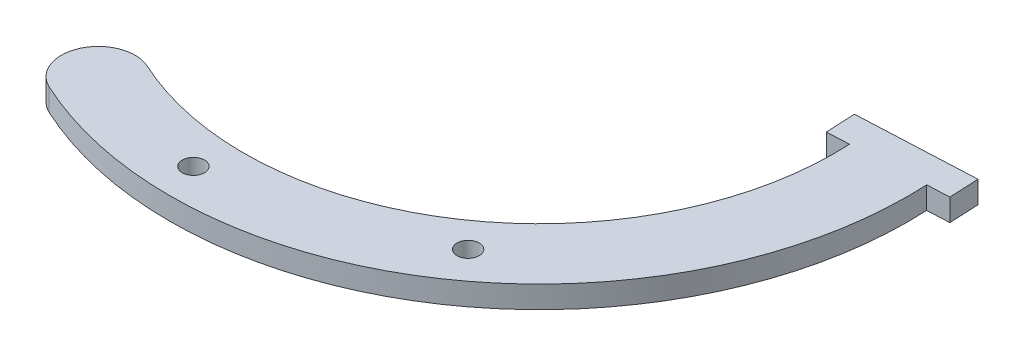
ISO-10303-21;
HEADER;
FILE_DESCRIPTION(('STEP AP214'),'2;1');
FILE_NAME('part.step','',(''),(''),'','','');
FILE_SCHEMA(('AUTOMOTIVE_DESIGN { 1 0 10303 214 1 1 1 1 }'));
ENDSEC;
DATA;
#1=APPLICATION_CONTEXT('core data for automotive mechanical design processes');
#2=APPLICATION_PROTOCOL_DEFINITION('international standard','automotive_design',2000,#1);
#3=PRODUCT_CONTEXT('',#1,'mechanical');
#4=PRODUCT('Part','Part','',(#3));
#5=PRODUCT_RELATED_PRODUCT_CATEGORY('part','',(#4));
#6=PRODUCT_DEFINITION_FORMATION('','',#4);
#7=PRODUCT_DEFINITION_CONTEXT('part definition',#1,'design');
#8=PRODUCT_DEFINITION('design','',#6,#7);
#9=PRODUCT_DEFINITION_SHAPE('','',#8);
#10=(LENGTH_UNIT() NAMED_UNIT(*) SI_UNIT(.MILLI.,.METRE.));
#11=(NAMED_UNIT(*) PLANE_ANGLE_UNIT() SI_UNIT($,.RADIAN.));
#12=(NAMED_UNIT(*) SI_UNIT($,.STERADIAN.) SOLID_ANGLE_UNIT());
#13=UNCERTAINTY_MEASURE_WITH_UNIT(LENGTH_MEASURE(1.E-05),#10,'distance_accuracy_value','');
#14=(GEOMETRIC_REPRESENTATION_CONTEXT(3) GLOBAL_UNCERTAINTY_ASSIGNED_CONTEXT((#13)) GLOBAL_UNIT_ASSIGNED_CONTEXT((#10,
#11,#12)) REPRESENTATION_CONTEXT('',''));
#15=CARTESIAN_POINT('',(0.,0.,0.));
#16=DIRECTION('',(0.,0.,1.));
#17=DIRECTION('',(1.,0.,0.));
#18=AXIS2_PLACEMENT_3D('',#15,#16,#17);
#19=CARTESIAN_POINT('',(2.25579232948525,3.,9.30013161079132));
#20=DIRECTION('',(0.,-1.,0.));
#21=DIRECTION('',(0.,0.,-1.));
#22=AXIS2_PLACEMENT_3D('',#19,#20,#21);
#23=CYLINDRICAL_SURFACE('',#22,5.);
#24=CARTESIAN_POINT('',(2.25579232948525,0.,9.30013161079132));
#25=DIRECTION('',(0.,1.,0.));
#26=DIRECTION('',(0.,0.,1.));
#27=AXIS2_PLACEMENT_3D('',#24,#25,#26);
#28=CIRCLE('',#27,5.);
#29=CARTESIAN_POINT('',(4.34663921270161,0.,4.7582862467411));
#30=VERTEX_POINT('',#29);
#31=CARTESIAN_POINT('',(0.164945446268869,0.,13.8419769748415));
#32=VERTEX_POINT('',#31);
#33=EDGE_CURVE('E150',#30,#32,#28,.T.);
#34=ORIENTED_EDGE('',*,*,#33,.T.);
#35=DIRECTION('',(0.,-1.,0.));
#36=VECTOR('',#35,1.);
#37=CARTESIAN_POINT('',(0.164945446268869,3.,13.8419769748415));
#38=LINE('',#37,#36);
#39=CARTESIAN_POINT('',(0.164945446268869,3.,13.8419769748415));
#40=VERTEX_POINT('',#39);
#41=EDGE_CURVE('E11',#40,#32,#38,.T.);
#42=ORIENTED_EDGE('',*,*,#41,.F.);
#43=CARTESIAN_POINT('',(2.25579232948525,3.,9.30013161079132));
#44=DIRECTION('',(0.,1.,0.));
#45=DIRECTION('',(0.,0.,1.));
#46=AXIS2_PLACEMENT_3D('',#43,#44,#45);
#47=CIRCLE('',#46,5.);
#48=CARTESIAN_POINT('',(4.34663921270161,3.,4.7582862467411));
#49=VERTEX_POINT('',#48);
#50=EDGE_CURVE('E207',#49,#40,#47,.T.);
#51=ORIENTED_EDGE('',*,*,#50,.F.);
#52=DIRECTION('',(0.,-1.,0.));
#53=VECTOR('',#52,1.);
#54=CARTESIAN_POINT('',(4.34663921270161,3.,4.7582862467411));
#55=LINE('',#54,#53);
#56=EDGE_CURVE('E57',#49,#30,#55,.T.);
#57=ORIENTED_EDGE('',*,*,#56,.T.);
#58=EDGE_LOOP('',(#34,#42,#51,#57));
#59=FACE_BOUND('',#58,.T.);
#60=ADVANCED_FACE('F40',(#59),#23,.T.);
#61=CARTESIAN_POINT('',(21.0734142784327,3.,-31.5764766656605));
#62=DIRECTION('',(0.,-1.,0.));
#63=DIRECTION('',(0.,0.,-1.));
#64=AXIS2_PLACEMENT_3D('',#61,#62,#63);
#65=CYLINDRICAL_SURFACE('',#64,50.);
#66=CARTESIAN_POINT('',(21.0734142784327,0.,-31.5764766656605));
#67=DIRECTION('',(0.,1.,0.));
#68=DIRECTION('',(0.,0.,1.));
#69=AXIS2_PLACEMENT_3D('',#66,#67,#68);
#70=CIRCLE('',#69,50.);
#71=CARTESIAN_POINT('',(71.0113295060892,0.,-34.067384675884));
#72=VERTEX_POINT('',#71);
#73=EDGE_CURVE('E152',#32,#72,#70,.T.);
#74=ORIENTED_EDGE('',*,*,#73,.T.);
#75=DIRECTION('',(0.,-1.,0.));
#76=VECTOR('',#75,1.);
#77=CARTESIAN_POINT('',(71.0113295060892,3.,-34.067384675884));
#78=LINE('',#77,#76);
#79=CARTESIAN_POINT('',(71.0113295060892,3.,-34.067384675884));
#80=VERTEX_POINT('',#79);
#81=EDGE_CURVE('E49',#80,#72,#78,.T.);
#82=ORIENTED_EDGE('',*,*,#81,.F.);
#83=CARTESIAN_POINT('',(21.0734142784327,3.,-31.5764766656605));
#84=DIRECTION('',(0.,1.,0.));
#85=DIRECTION('',(0.,0.,1.));
#86=AXIS2_PLACEMENT_3D('',#83,#84,#85);
#87=CIRCLE('',#86,50.);
#88=EDGE_CURVE('E98',#40,#80,#87,.T.);
#89=ORIENTED_EDGE('',*,*,#88,.F.);
#90=ORIENTED_EDGE('',*,*,#41,.T.);
#91=EDGE_LOOP('',(#74,#82,#89,#90));
#92=FACE_BOUND('',#91,.T.);
#93=ADVANCED_FACE('F235',(#92),#65,.T.);
#94=CARTESIAN_POINT('',(-1.42214087214097,3.,-30.7134611929984));
#95=DIRECTION('',(-0.0462539459495226,0.,-0.998929713485438));
#96=DIRECTION('',(-0.998929713485438,0.,0.0462539459495226));
#97=AXIS2_PLACEMENT_3D('',#94,#95,#96);
#98=PLANE('',#97);
#99=DIRECTION('',(0.998929713485438,0.,-0.0462539459495226));
#100=VECTOR('',#99,1.);
#101=CARTESIAN_POINT('',(-1.42214087214097,0.,-30.7134611929984));
#102=LINE('',#101,#100);
#103=CARTESIAN_POINT('',(74.0080788981386,0.,-34.2061446732421));
#104=VERTEX_POINT('',#103);
#105=EDGE_CURVE('E154',#72,#104,#102,.T.);
#106=ORIENTED_EDGE('',*,*,#105,.T.);
#107=DIRECTION('',(0.,-1.,0.));
#108=VECTOR('',#107,1.);
#109=CARTESIAN_POINT('',(74.0080788981386,3.,-34.2061446732421));
#110=LINE('',#109,#108);
#111=CARTESIAN_POINT('',(74.0080788981386,3.,-34.2061446732421));
#112=VERTEX_POINT('',#111);
#113=EDGE_CURVE('E178',#112,#104,#110,.T.);
#114=ORIENTED_EDGE('',*,*,#113,.F.);
#115=DIRECTION('',(0.998929713485438,0.,-0.0462539459495226));
#116=VECTOR('',#115,1.);
#117=CARTESIAN_POINT('',(-1.42214087214097,3.,-30.7134611929984));
#118=LINE('',#117,#116);
#119=EDGE_CURVE('E186',#80,#112,#118,.T.);
#120=ORIENTED_EDGE('',*,*,#119,.F.);
#121=ORIENTED_EDGE('',*,*,#81,.T.);
#122=EDGE_LOOP('',(#106,#114,#120,#121));
#123=FACE_BOUND('',#122,.T.);
#124=ADVANCED_FACE('F184',(#123),#98,.F.);
#125=CARTESIAN_POINT('',(75.4302197702796,3.,-3.4926834802437));
#126=DIRECTION('',(-0.998929713485438,0.,0.0462539459495231));
#127=DIRECTION('',(0.0462539459495231,0.,0.998929713485438));
#128=AXIS2_PLACEMENT_3D('',#125,#126,#127);
#129=PLANE('',#128);
#130=DIRECTION('',(-0.0462539459495231,0.,-0.998929713485438));
#131=VECTOR('',#130,1.);
#132=CARTESIAN_POINT('',(75.4302197702796,0.,-3.4926834802437));
#133=LINE('',#132,#131);
#134=CARTESIAN_POINT('',(73.8230631143406,0.,-38.2018635271838));
#135=VERTEX_POINT('',#134);
#136=EDGE_CURVE('E156',#104,#135,#133,.T.);
#137=ORIENTED_EDGE('',*,*,#136,.T.);
#138=DIRECTION('',(0.,-1.,0.));
#139=VECTOR('',#138,1.);
#140=CARTESIAN_POINT('',(73.8230631143406,3.,-38.2018635271838));
#141=LINE('',#140,#139);
#142=CARTESIAN_POINT('',(73.8230631143406,3.,-38.2018635271838));
#143=VERTEX_POINT('',#142);
#144=EDGE_CURVE('E175',#143,#135,#141,.T.);
#145=ORIENTED_EDGE('',*,*,#144,.F.);
#146=DIRECTION('',(-0.0462539459495231,0.,-0.998929713485438));
#147=VECTOR('',#146,1.);
#148=CARTESIAN_POINT('',(75.4302197702796,3.,-3.4926834802437));
#149=LINE('',#148,#147);
#150=EDGE_CURVE('E201',#112,#143,#149,.T.);
#151=ORIENTED_EDGE('',*,*,#150,.F.);
#152=ORIENTED_EDGE('',*,*,#113,.T.);
#153=EDGE_LOOP('',(#137,#145,#151,#152));
#154=FACE_BOUND('',#153,.T.);
#155=ADVANCED_FACE('F194',(#154),#129,.F.);
#156=CARTESIAN_POINT('',(-1.6071566559391,3.,-34.70918004694));
#157=DIRECTION('',(0.046253945949524,0.,0.998929713485438));
#158=DIRECTION('',(0.998929713485438,0.,-0.046253945949524));
#159=AXIS2_PLACEMENT_3D('',#156,#157,#158);
#160=PLANE('',#159);
#161=DIRECTION('',(-0.998929713485438,0.,0.046253945949524));
#162=VECTOR('',#161,1.);
#163=CARTESIAN_POINT('',(-1.6071566559391,0.,-34.70918004694));
#164=LINE('',#163,#162);
#165=CARTESIAN_POINT('',(57.8401876985736,0.,-37.4618003919914));
#166=VERTEX_POINT('',#165);
#167=EDGE_CURVE('E158',#135,#166,#164,.T.);
#168=ORIENTED_EDGE('',*,*,#167,.T.);
#169=DIRECTION('',(0.,-1.,0.));
#170=VECTOR('',#169,1.);
#171=CARTESIAN_POINT('',(57.8401876985736,3.,-37.4618003919914));
#172=LINE('',#171,#170);
#173=CARTESIAN_POINT('',(57.8401876985736,3.,-37.4618003919914));
#174=VERTEX_POINT('',#173);
#175=EDGE_CURVE('E172',#174,#166,#172,.T.);
#176=ORIENTED_EDGE('',*,*,#175,.F.);
#177=DIRECTION('',(-0.998929713485438,0.,0.046253945949524));
#178=VECTOR('',#177,1.);
#179=CARTESIAN_POINT('',(-1.6071566559391,3.,-34.70918004694));
#180=LINE('',#179,#178);
#181=EDGE_CURVE('E200',#143,#174,#180,.T.);
#182=ORIENTED_EDGE('',*,*,#181,.F.);
#183=ORIENTED_EDGE('',*,*,#144,.T.);
#184=EDGE_LOOP('',(#168,#176,#182,#183));
#185=FACE_BOUND('',#184,.T.);
#186=ADVANCED_FACE('F198',(#185),#160,.F.);
#187=CARTESIAN_POINT('',(59.4473443545129,3.,-2.75262034505176));
#188=DIRECTION('',(0.998929713485437,0.,-0.0462539459495301));
#189=DIRECTION('',(-0.0462539459495301,0.,-0.998929713485437));
#190=AXIS2_PLACEMENT_3D('',#187,#188,#189);
#191=PLANE('',#190);
#192=DIRECTION('',(0.0462539459495301,0.,0.998929713485437));
#193=VECTOR('',#192,1.);
#194=CARTESIAN_POINT('',(59.4473443545129,0.,-2.75262034505176));
#195=LINE('',#194,#193);
#196=CARTESIAN_POINT('',(58.0252034823717,0.,-33.4660815380497));
#197=VERTEX_POINT('',#196);
#198=EDGE_CURVE('E160',#166,#197,#195,.T.);
#199=ORIENTED_EDGE('',*,*,#198,.T.);
#200=DIRECTION('',(0.,-1.,0.));
#201=VECTOR('',#200,1.);
#202=CARTESIAN_POINT('',(58.0252034823717,3.,-33.4660815380497));
#203=LINE('',#202,#201);
#204=CARTESIAN_POINT('',(58.0252034823717,3.,-33.4660815380497));
#205=VERTEX_POINT('',#204);
#206=EDGE_CURVE('E136',#205,#197,#203,.T.);
#207=ORIENTED_EDGE('',*,*,#206,.F.);
#208=DIRECTION('',(0.0462539459495301,0.,0.998929713485437));
#209=VECTOR('',#208,1.);
#210=CARTESIAN_POINT('',(59.4473443545129,3.,-2.75262034505176));
#211=LINE('',#210,#209);
#212=EDGE_CURVE('E124',#174,#205,#211,.T.);
#213=ORIENTED_EDGE('',*,*,#212,.F.);
#214=ORIENTED_EDGE('',*,*,#175,.T.);
#215=EDGE_LOOP('',(#199,#207,#213,#214));
#216=FACE_BOUND('',#215,.T.);
#217=ADVANCED_FACE('F248',(#216),#191,.F.);
#218=CARTESIAN_POINT('',(-1.42214087214096,3.,-30.7134611929984));
#219=DIRECTION('',(-0.0462539459495224,0.,-0.998929713485438));
#220=DIRECTION('',(-0.998929713485438,0.,0.0462539459495224));
#221=AXIS2_PLACEMENT_3D('',#218,#219,#220);
#222=PLANE('',#221);
#223=DIRECTION('',(0.998929713485438,0.,-0.0462539459495224));
#224=VECTOR('',#223,1.);
#225=CARTESIAN_POINT('',(-1.42214087214096,0.,-30.7134611929984));
#226=LINE('',#225,#224);
#227=CARTESIAN_POINT('',(61.0219528744211,0.,-33.6048415354077));
#228=VERTEX_POINT('',#227);
#229=EDGE_CURVE('E133',#197,#228,#226,.T.);
#230=ORIENTED_EDGE('',*,*,#229,.T.);
#231=DIRECTION('',(0.,-1.,0.));
#232=VECTOR('',#231,1.);
#233=CARTESIAN_POINT('',(61.0219528744211,3.,-33.6048415354077));
#234=LINE('',#233,#232);
#235=CARTESIAN_POINT('',(61.0219528744211,3.,-33.6048415354077));
#236=VERTEX_POINT('',#235);
#237=EDGE_CURVE('E130',#236,#228,#234,.T.);
#238=ORIENTED_EDGE('',*,*,#237,.F.);
#239=DIRECTION('',(0.998929713485438,0.,-0.0462539459495224));
#240=VECTOR('',#239,1.);
#241=CARTESIAN_POINT('',(-1.42214087214096,3.,-30.7134611929984));
#242=LINE('',#241,#240);
#243=EDGE_CURVE('E117',#205,#236,#242,.T.);
#244=ORIENTED_EDGE('',*,*,#243,.F.);
#245=ORIENTED_EDGE('',*,*,#206,.T.);
#246=EDGE_LOOP('',(#230,#238,#244,#245));
#247=FACE_BOUND('',#246,.T.);
#248=ADVANCED_FACE('F131',(#247),#222,.F.);
#249=CARTESIAN_POINT('',(62.5547517377379,3.,-3.14820928200102));
#250=DIRECTION('',(-0.998735984078569,0.,0.0502636459741192));
#251=DIRECTION('',(0.0502636459741192,0.,0.99873598407857));
#252=AXIS2_PLACEMENT_3D('',#249,#250,#251);
#253=PLANE('',#252);
#254=DIRECTION('',(-0.0502636459741192,0.,-0.998735984078569));
#255=VECTOR('',#254,1.);
#256=CARTESIAN_POINT('',(62.5547517377379,0.,-3.14820928200102));
#257=LINE('',#256,#255);
#258=CARTESIAN_POINT('',(61.0237464605579,0.,-33.5692030738393));
#259=VERTEX_POINT('',#258);
#260=EDGE_CURVE('E163',#259,#228,#257,.T.);
#261=ORIENTED_EDGE('',*,*,#260,.F.);
#262=DIRECTION('',(0.,-1.,0.));
#263=VECTOR('',#262,1.);
#264=CARTESIAN_POINT('',(61.0237464605579,3.,-33.5692030738393));
#265=LINE('',#264,#263);
#266=CARTESIAN_POINT('',(61.0237464605579,3.,-33.5692030738393));
#267=VERTEX_POINT('',#266);
#268=EDGE_CURVE('E86',#267,#259,#265,.T.);
#269=ORIENTED_EDGE('',*,*,#268,.F.);
#270=DIRECTION('',(-0.0502636459741192,0.,-0.998735984078569));
#271=VECTOR('',#270,1.);
#272=CARTESIAN_POINT('',(62.5547517377379,3.,-3.14820928200102));
#273=LINE('',#272,#271);
#274=EDGE_CURVE('E122',#267,#236,#273,.T.);
#275=ORIENTED_EDGE('',*,*,#274,.T.);
#276=ORIENTED_EDGE('',*,*,#237,.T.);
#277=EDGE_LOOP('',(#261,#269,#275,#276));
#278=FACE_BOUND('',#277,.T.);
#279=ADVANCED_FACE('F138',(#278),#253,.T.);
#280=CARTESIAN_POINT('',(19.224207172253,3.,13.390815296017));
#281=DIRECTION('',(0.,-1.,0.));
#282=DIRECTION('',(0.,0.,-1.));
#283=AXIS2_PLACEMENT_3D('',#280,#281,#282);
#284=CYLINDRICAL_SURFACE('',#283,1.5);
#285=CARTESIAN_POINT('',(19.224207172253,3.,13.390815296017));
#286=DIRECTION('',(0.,1.,0.));
#287=DIRECTION('',(0.,0.,1.));
#288=AXIS2_PLACEMENT_3D('',#285,#286,#287);
#289=CIRCLE('',#288,1.5);
#290=CARTESIAN_POINT('',(19.224207172253,3.,14.890815296017));
#291=VERTEX_POINT('',#290);
#292=EDGE_CURVE('E209',#291,#291,#289,.T.);
#293=ORIENTED_EDGE('',*,*,#292,.T.);
#294=EDGE_LOOP('',(#293));
#295=FACE_BOUND('',#294,.T.);
#296=CARTESIAN_POINT('',(19.224207172253,0.,13.390815296017));
#297=DIRECTION('',(0.,1.,0.));
#298=DIRECTION('',(0.,0.,1.));
#299=AXIS2_PLACEMENT_3D('',#296,#297,#298);
#300=CIRCLE('',#299,1.5);
#301=CARTESIAN_POINT('',(19.224207172253,0.,14.890815296017));
#302=VERTEX_POINT('',#301);
#303=EDGE_CURVE('E147',#302,#302,#300,.T.);
#304=ORIENTED_EDGE('',*,*,#303,.F.);
#305=EDGE_LOOP('',(#304));
#306=FACE_BOUND('',#305,.T.);
#307=ADVANCED_FACE('F223',(#295,#306),#284,.F.);
#308=CARTESIAN_POINT('',(47.5376826509428,3.,4.51986058864674));
#309=DIRECTION('',(0.,-1.,0.));
#310=DIRECTION('',(0.,0.,-1.));
#311=AXIS2_PLACEMENT_3D('',#308,#309,#310);
#312=CYLINDRICAL_SURFACE('',#311,1.5);
#313=CARTESIAN_POINT('',(47.5376826509428,3.,4.51986058864674));
#314=DIRECTION('',(0.,1.,0.));
#315=DIRECTION('',(0.,0.,1.));
#316=AXIS2_PLACEMENT_3D('',#313,#314,#315);
#317=CIRCLE('',#316,1.5);
#318=CARTESIAN_POINT('',(47.5376826509428,3.,6.01986058864674));
#319=VERTEX_POINT('',#318);
#320=EDGE_CURVE('E168',#319,#319,#317,.T.);
#321=ORIENTED_EDGE('',*,*,#320,.T.);
#322=EDGE_LOOP('',(#321));
#323=FACE_BOUND('',#322,.T.);
#324=CARTESIAN_POINT('',(47.5376826509428,0.,4.51986058864674));
#325=DIRECTION('',(0.,1.,0.));
#326=DIRECTION('',(0.,0.,1.));
#327=AXIS2_PLACEMENT_3D('',#324,#325,#326);
#328=CIRCLE('',#327,1.5);
#329=CARTESIAN_POINT('',(47.5376826509428,0.,6.01986058864674));
#330=VERTEX_POINT('',#329);
#331=EDGE_CURVE('E144',#330,#330,#328,.T.);
#332=ORIENTED_EDGE('',*,*,#331,.F.);
#333=EDGE_LOOP('',(#332));
#334=FACE_BOUND('',#333,.T.);
#335=ADVANCED_FACE('F42',(#323,#334),#312,.F.);
#336=CARTESIAN_POINT('',(21.0734142784327,3.,-31.5764766656605));
#337=DIRECTION('',(0.,-1.,0.));
#338=DIRECTION('',(0.,0.,-1.));
#339=AXIS2_PLACEMENT_3D('',#336,#337,#338);
#340=CYLINDRICAL_SURFACE('',#339,40.);
#341=CARTESIAN_POINT('',(21.0734142784327,0.,-31.5764766656605));
#342=DIRECTION('',(0.,1.,0.));
#343=DIRECTION('',(0.,0.,1.));
#344=AXIS2_PLACEMENT_3D('',#341,#342,#343);
#345=CIRCLE('',#344,40.);
#346=EDGE_CURVE('E165',#30,#259,#345,.T.);
#347=ORIENTED_EDGE('',*,*,#346,.F.);
#348=ORIENTED_EDGE('',*,*,#56,.F.);
#349=CARTESIAN_POINT('',(21.0734142784327,3.,-31.5764766656605));
#350=DIRECTION('',(0.,1.,0.));
#351=DIRECTION('',(0.,0.,1.));
#352=AXIS2_PLACEMENT_3D('',#349,#350,#351);
#353=CIRCLE('',#352,40.);
#354=EDGE_CURVE('E139',#49,#267,#353,.T.);
#355=ORIENTED_EDGE('',*,*,#354,.T.);
#356=ORIENTED_EDGE('',*,*,#268,.T.);
#357=EDGE_LOOP('',(#347,#348,#355,#356));
#358=FACE_BOUND('',#357,.T.);
#359=ADVANCED_FACE('F219',(#358),#340,.F.);
#360=CARTESIAN_POINT('',(0.,3.,0.));
#361=DIRECTION('',(0.,1.,0.));
#362=DIRECTION('',(0.,0.,1.));
#363=AXIS2_PLACEMENT_3D('',#360,#361,#362);
#364=PLANE('',#363);
#365=ORIENTED_EDGE('',*,*,#320,.F.);
#366=EDGE_LOOP('',(#365));
#367=FACE_BOUND('',#366,.T.);
#368=ORIENTED_EDGE('',*,*,#292,.F.);
#369=EDGE_LOOP('',(#368));
#370=FACE_BOUND('',#369,.T.);
#371=ORIENTED_EDGE('',*,*,#50,.T.);
#372=ORIENTED_EDGE('',*,*,#88,.T.);
#373=ORIENTED_EDGE('',*,*,#119,.T.);
#374=ORIENTED_EDGE('',*,*,#150,.T.);
#375=ORIENTED_EDGE('',*,*,#181,.T.);
#376=ORIENTED_EDGE('',*,*,#212,.T.);
#377=ORIENTED_EDGE('',*,*,#243,.T.);
#378=ORIENTED_EDGE('',*,*,#274,.F.);
#379=ORIENTED_EDGE('',*,*,#354,.F.);
#380=EDGE_LOOP('',(#371,#372,#373,#374,#375,#376,#377,#378,#379));
#381=FACE_BOUND('',#380,.T.);
#382=ADVANCED_FACE('F119',(#367,#370,#381),#364,.T.);
#383=CARTESIAN_POINT('',(0.,0.,0.));
#384=DIRECTION('',(0.,1.,0.));
#385=DIRECTION('',(0.,0.,1.));
#386=AXIS2_PLACEMENT_3D('',#383,#384,#385);
#387=PLANE('',#386);
#388=ORIENTED_EDGE('',*,*,#331,.T.);
#389=EDGE_LOOP('',(#388));
#390=FACE_BOUND('',#389,.T.);
#391=ORIENTED_EDGE('',*,*,#303,.T.);
#392=EDGE_LOOP('',(#391));
#393=FACE_BOUND('',#392,.T.);
#394=ORIENTED_EDGE('',*,*,#33,.F.);
#395=ORIENTED_EDGE('',*,*,#346,.T.);
#396=ORIENTED_EDGE('',*,*,#260,.T.);
#397=ORIENTED_EDGE('',*,*,#229,.F.);
#398=ORIENTED_EDGE('',*,*,#198,.F.);
#399=ORIENTED_EDGE('',*,*,#167,.F.);
#400=ORIENTED_EDGE('',*,*,#136,.F.);
#401=ORIENTED_EDGE('',*,*,#105,.F.);
#402=ORIENTED_EDGE('',*,*,#73,.F.);
#403=EDGE_LOOP('',(#394,#395,#396,#397,#398,#399,#400,#401,#402));
#404=FACE_BOUND('',#403,.T.);
#405=ADVANCED_FACE('F189',(#390,#393,#404),#387,.F.);
#406=CLOSED_SHELL('',(#60,#93,#124,#155,#186,#217,#248,#279,#307,#335,#359,#382,#405));
#407=MANIFOLD_SOLID_BREP('B2',#406);
#408=ADVANCED_BREP_SHAPE_REPRESENTATION('',(#18,#407),#14);
#409=SHAPE_DEFINITION_REPRESENTATION(#9,#408);
ENDSEC;
END-ISO-10303-21;
